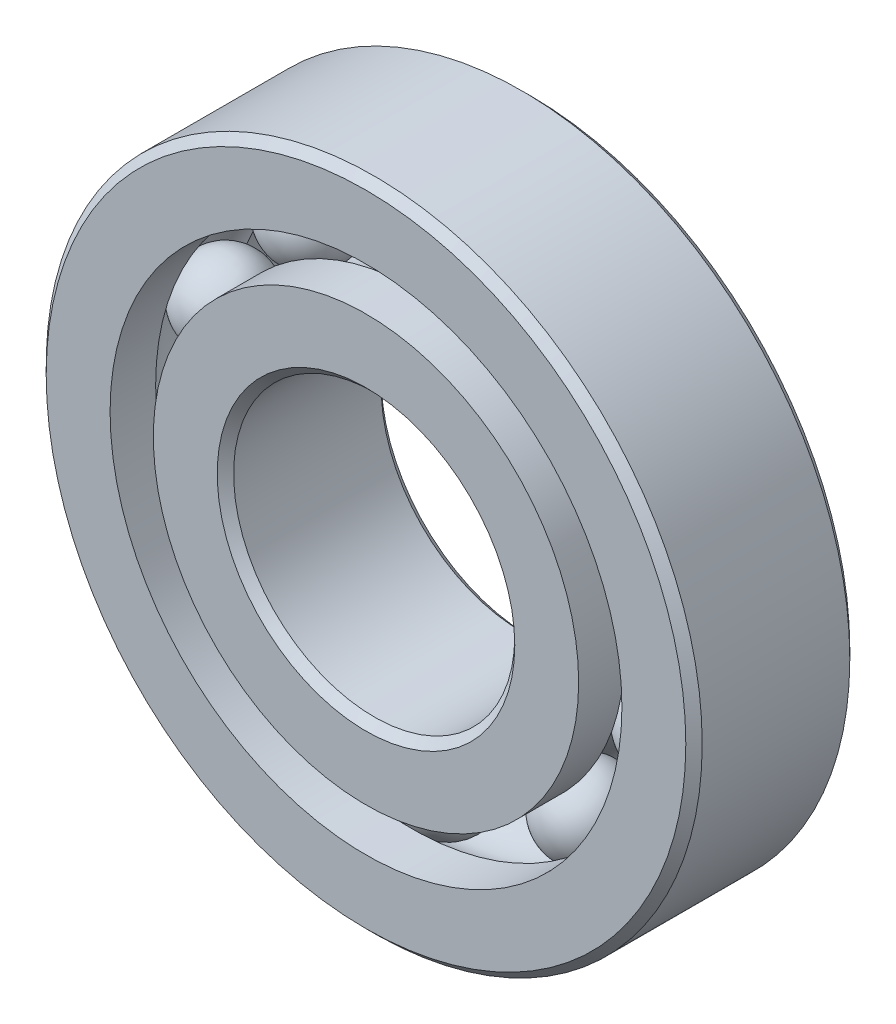
ISO-10303-21;
HEADER;
FILE_DESCRIPTION(('STEP AP214'),'2;1');
FILE_NAME('part.step','',(''),(''),'','','');
FILE_SCHEMA(('AUTOMOTIVE_DESIGN { 1 0 10303 214 1 1 1 1 }'));
ENDSEC;
DATA;
#1=APPLICATION_CONTEXT('core data for automotive mechanical design processes');
#2=APPLICATION_PROTOCOL_DEFINITION('international standard','automotive_design',2000,#1);
#3=PRODUCT_CONTEXT('',#1,'mechanical');
#4=PRODUCT('Part','Part','',(#3));
#5=PRODUCT_RELATED_PRODUCT_CATEGORY('part','',(#4));
#6=PRODUCT_DEFINITION_FORMATION('','',#4);
#7=PRODUCT_DEFINITION_CONTEXT('part definition',#1,'design');
#8=PRODUCT_DEFINITION('design','',#6,#7);
#9=PRODUCT_DEFINITION_SHAPE('','',#8);
#10=(LENGTH_UNIT() NAMED_UNIT(*) SI_UNIT(.MILLI.,.METRE.));
#11=(NAMED_UNIT(*) PLANE_ANGLE_UNIT() SI_UNIT($,.RADIAN.));
#12=(NAMED_UNIT(*) SI_UNIT($,.STERADIAN.) SOLID_ANGLE_UNIT());
#13=UNCERTAINTY_MEASURE_WITH_UNIT(LENGTH_MEASURE(1.E-05),#10,'distance_accuracy_value','');
#14=(GEOMETRIC_REPRESENTATION_CONTEXT(3) GLOBAL_UNCERTAINTY_ASSIGNED_CONTEXT((#13)) GLOBAL_UNIT_ASSIGNED_CONTEXT((#10,
#11,#12)) REPRESENTATION_CONTEXT('',''));
#15=CARTESIAN_POINT('',(0.,0.,0.));
#16=DIRECTION('',(0.,0.,1.));
#17=DIRECTION('',(1.,0.,0.));
#18=AXIS2_PLACEMENT_3D('',#15,#16,#17);
#19=CARTESIAN_POINT('',(-4.66554544007142,6.42157239285121,0.));
#20=DIRECTION('',(0.,0.,1.));
#21=DIRECTION('',(-0.587785252292462,0.809016994374955,0.));
#22=AXIS2_PLACEMENT_3D('',#19,#20,#21);
#23=SPHERICAL_SURFACE('',#22,1.43574962434293);
#24=CARTESIAN_POINT('',(-4.66554544007142,6.42157239285121,1.43574962434293));
#25=VERTEX_POINT('',#24);
#26=VERTEX_LOOP('',#25);
#27=FACE_BOUND('',#26,.T.);
#28=ADVANCED_FACE('F40',(#27),#23,.T.);
#29=CLOSED_SHELL('',(#28));
#30=MANIFOLD_SOLID_BREP('B2',#29);
#31=CARTESIAN_POINT('',(-7.54901109809275,2.45282239285123,0.));
#32=DIRECTION('',(0.,0.,1.));
#33=DIRECTION('',(-0.95105651629515,0.309016994374958,0.));
#34=AXIS2_PLACEMENT_3D('',#31,#32,#33);
#35=SPHERICAL_SURFACE('',#34,1.43574962434293);
#36=CARTESIAN_POINT('',(-7.54901109809275,2.45282239285123,1.43574962434293));
#37=VERTEX_POINT('',#36);
#38=VERTEX_LOOP('',#37);
#39=FACE_BOUND('',#38,.T.);
#40=ADVANCED_FACE('F61',(#39),#35,.T.);
#41=CLOSED_SHELL('',(#40));
#42=MANIFOLD_SOLID_BREP('B6',#41);
#43=CARTESIAN_POINT('',(-7.54901109809281,-2.45282239285107,0.));
#44=DIRECTION('',(0.,0.,1.));
#45=DIRECTION('',(-0.951056516295157,-0.309016994374938,0.));
#46=AXIS2_PLACEMENT_3D('',#43,#44,#45);
#47=SPHERICAL_SURFACE('',#46,1.43574962434293);
#48=CARTESIAN_POINT('',(-7.54901109809281,-2.45282239285107,1.43574962434293));
#49=VERTEX_POINT('',#48);
#50=VERTEX_LOOP('',#49);
#51=FACE_BOUND('',#50,.T.);
#52=ADVANCED_FACE('F82',(#51),#47,.T.);
#53=CLOSED_SHELL('',(#52));
#54=MANIFOLD_SOLID_BREP('B36',#53);
#55=CARTESIAN_POINT('',(-4.66554544007156,-6.4215723928511,0.));
#56=DIRECTION('',(0.,0.,1.));
#57=DIRECTION('',(-0.58778525229248,-0.809016994374942,0.));
#58=AXIS2_PLACEMENT_3D('',#55,#56,#57);
#59=SPHERICAL_SURFACE('',#58,1.43574962434293);
#60=CARTESIAN_POINT('',(-4.66554544007156,-6.4215723928511,1.43574962434293));
#61=VERTEX_POINT('',#60);
#62=VERTEX_LOOP('',#61);
#63=FACE_BOUND('',#62,.T.);
#64=ADVANCED_FACE('F103',(#63),#59,.T.);
#65=CLOSED_SHELL('',(#64));
#66=MANIFOLD_SOLID_BREP('B57',#65);
#67=CARTESIAN_POINT('',(0.,-7.9375,0.));
#68=DIRECTION('',(0.,0.,1.));
#69=DIRECTION('',(0.,-1.,0.));
#70=AXIS2_PLACEMENT_3D('',#67,#68,#69);
#71=SPHERICAL_SURFACE('',#70,1.43574962434293);
#72=CARTESIAN_POINT('',(0.,-7.9375,1.43574962434293));
#73=VERTEX_POINT('',#72);
#74=VERTEX_LOOP('',#73);
#75=FACE_BOUND('',#74,.T.);
#76=ADVANCED_FACE('F124',(#75),#71,.T.);
#77=CLOSED_SHELL('',(#76));
#78=MANIFOLD_SOLID_BREP('B78',#77);
#79=CARTESIAN_POINT('',(4.66554544007147,-6.42157239285117,0.));
#80=DIRECTION('',(0.,0.,1.));
#81=DIRECTION('',(0.587785252292469,-0.809016994374951,0.));
#82=AXIS2_PLACEMENT_3D('',#79,#80,#81);
#83=SPHERICAL_SURFACE('',#82,1.43574962434293);
#84=CARTESIAN_POINT('',(4.66554544007147,-6.42157239285117,1.43574962434293));
#85=VERTEX_POINT('',#84);
#86=VERTEX_LOOP('',#85);
#87=FACE_BOUND('',#86,.T.);
#88=ADVANCED_FACE('F145',(#87),#83,.T.);
#89=CLOSED_SHELL('',(#88));
#90=MANIFOLD_SOLID_BREP('B99',#89);
#91=CARTESIAN_POINT('',(7.54901109809277,-2.45282239285118,0.));
#92=DIRECTION('',(0.,0.,1.));
#93=DIRECTION('',(0.951056516295152,-0.309016994374952,0.));
#94=AXIS2_PLACEMENT_3D('',#91,#92,#93);
#95=SPHERICAL_SURFACE('',#94,1.43574962434293);
#96=CARTESIAN_POINT('',(7.54901109809277,-2.45282239285118,1.43574962434293));
#97=VERTEX_POINT('',#96);
#98=VERTEX_LOOP('',#97);
#99=FACE_BOUND('',#98,.T.);
#100=ADVANCED_FACE('F166',(#99),#95,.T.);
#101=CLOSED_SHELL('',(#100));
#102=MANIFOLD_SOLID_BREP('B120',#101);
#103=CARTESIAN_POINT('',(7.54901109809279,2.45282239285112,0.));
#104=DIRECTION('',(0.,0.,1.));
#105=DIRECTION('',(0.951056516295155,0.309016994374945,0.));
#106=AXIS2_PLACEMENT_3D('',#103,#104,#105);
#107=SPHERICAL_SURFACE('',#106,1.43574962434293);
#108=CARTESIAN_POINT('',(7.54901109809279,2.45282239285112,1.43574962434293));
#109=VERTEX_POINT('',#108);
#110=VERTEX_LOOP('',#109);
#111=FACE_BOUND('',#110,.T.);
#112=ADVANCED_FACE('F187',(#111),#107,.T.);
#113=CLOSED_SHELL('',(#112));
#114=MANIFOLD_SOLID_BREP('B141',#113);
#115=CARTESIAN_POINT('',(4.66554544007152,6.42157239285114,0.));
#116=DIRECTION('',(0.,0.,1.));
#117=DIRECTION('',(0.587785252292474,0.809016994374947,0.));
#118=AXIS2_PLACEMENT_3D('',#115,#116,#117);
#119=SPHERICAL_SURFACE('',#118,1.43574962434293);
#120=CARTESIAN_POINT('',(4.66554544007152,6.42157239285114,1.43574962434293));
#121=VERTEX_POINT('',#120);
#122=VERTEX_LOOP('',#121);
#123=FACE_BOUND('',#122,.T.);
#124=ADVANCED_FACE('F208',(#123),#119,.T.);
#125=CLOSED_SHELL('',(#124));
#126=MANIFOLD_SOLID_BREP('B162',#125);
#127=CARTESIAN_POINT('',(0.,7.9375,0.));
#128=DIRECTION('',(0.,0.,1.));
#129=DIRECTION('',(0.,1.,0.));
#130=AXIS2_PLACEMENT_3D('',#127,#128,#129);
#131=SPHERICAL_SURFACE('',#130,1.43574962434293);
#132=CARTESIAN_POINT('',(0.,7.9375,1.43574962434293));
#133=VERTEX_POINT('',#132);
#134=VERTEX_LOOP('',#133);
#135=FACE_BOUND('',#134,.T.);
#136=ADVANCED_FACE('F231',(#135),#131,.T.);
#137=CLOSED_SHELL('',(#136));
#138=MANIFOLD_SOLID_BREP('B183',#137);
#139=CARTESIAN_POINT('',(0.,7.20480769230769,2.778125));
#140=DIRECTION('',(0.,0.,-1.));
#141=DIRECTION('',(-1.,0.,0.));
#142=AXIS2_PLACEMENT_3D('',#139,#140,#141);
#143=PLANE('',#142);
#144=CARTESIAN_POINT('',(0.,0.,2.778125));
#145=DIRECTION('',(0.,0.,1.));
#146=DIRECTION('',(1.,0.,0.));
#147=AXIS2_PLACEMENT_3D('',#144,#145,#146);
#148=CIRCLE('',#147,5.0403125);
#149=CARTESIAN_POINT('',(5.0403125,0.,2.778125));
#150=VERTEX_POINT('',#149);
#151=EDGE_CURVE('E279',#150,#150,#148,.T.);
#152=ORIENTED_EDGE('',*,*,#151,.F.);
#153=EDGE_LOOP('',(#152));
#154=FACE_BOUND('',#153,.T.);
#155=CARTESIAN_POINT('',(0.,0.,2.778125));
#156=DIRECTION('',(0.,0.,1.));
#157=DIRECTION('',(1.,0.,0.));
#158=AXIS2_PLACEMENT_3D('',#155,#156,#157);
#159=CIRCLE('',#158,7.20480769230769);
#160=CARTESIAN_POINT('',(7.20480769230769,0.,2.778125));
#161=VERTEX_POINT('',#160);
#162=EDGE_CURVE('E230',#161,#161,#159,.T.);
#163=ORIENTED_EDGE('',*,*,#162,.T.);
#164=EDGE_LOOP('',(#163));
#165=FACE_BOUND('',#164,.T.);
#166=ADVANCED_FACE('F251',(#154,#165),#143,.F.);
#167=CARTESIAN_POINT('',(0.,0.,2.778125));
#168=DIRECTION('',(0.,0.,1.));
#169=DIRECTION('',(1.,0.,0.));
#170=AXIS2_PLACEMENT_3D('',#167,#168,#169);
#171=CYLINDRICAL_SURFACE('',#170,7.20480769230769);
#172=ORIENTED_EDGE('',*,*,#162,.F.);
#173=EDGE_LOOP('',(#172));
#174=FACE_BOUND('',#173,.T.);
#175=CARTESIAN_POINT('',(0.,0.,1.23472222222222));
#176=DIRECTION('',(0.,0.,1.));
#177=DIRECTION('',(1.,0.,0.));
#178=AXIS2_PLACEMENT_3D('',#175,#176,#177);
#179=CIRCLE('',#178,7.20480769230769);
#180=CARTESIAN_POINT('',(7.20480769230769,0.,1.23472222222222));
#181=VERTEX_POINT('',#180);
#182=EDGE_CURVE('E257',#181,#181,#179,.T.);
#183=ORIENTED_EDGE('',*,*,#182,.T.);
#184=EDGE_LOOP('',(#183));
#185=FACE_BOUND('',#184,.T.);
#186=ADVANCED_FACE('F286',(#174,#185),#171,.T.);
#187=CARTESIAN_POINT('',(0.,0.,0.));
#188=DIRECTION('',(0.,0.,1.));
#189=DIRECTION('',(1.,0.,0.));
#190=AXIS2_PLACEMENT_3D('',#187,#188,#189);
#191=TOROIDAL_SURFACE('',#190,7.9375,1.43574962434293);
#192=ORIENTED_EDGE('',*,*,#182,.F.);
#193=EDGE_LOOP('',(#192));
#194=FACE_BOUND('',#193,.T.);
#195=CARTESIAN_POINT('',(0.,0.,-1.23472222222222));
#196=DIRECTION('',(0.,0.,1.));
#197=DIRECTION('',(1.,0.,0.));
#198=AXIS2_PLACEMENT_3D('',#195,#196,#197);
#199=CIRCLE('',#198,7.20480769230769);
#200=CARTESIAN_POINT('',(7.20480769230769,0.,-1.23472222222222));
#201=VERTEX_POINT('',#200);
#202=EDGE_CURVE('E261',#201,#201,#199,.T.);
#203=ORIENTED_EDGE('',*,*,#202,.T.);
#204=EDGE_LOOP('',(#203));
#205=FACE_BOUND('',#204,.T.);
#206=ADVANCED_FACE('F290',(#194,#205),#191,.F.);
#207=CARTESIAN_POINT('',(0.,0.,2.778125));
#208=DIRECTION('',(0.,0.,1.));
#209=DIRECTION('',(1.,0.,0.));
#210=AXIS2_PLACEMENT_3D('',#207,#208,#209);
#211=CYLINDRICAL_SURFACE('',#210,7.20480769230769);
#212=ORIENTED_EDGE('',*,*,#202,.F.);
#213=EDGE_LOOP('',(#212));
#214=FACE_BOUND('',#213,.T.);
#215=CARTESIAN_POINT('',(0.,0.,-2.778125));
#216=DIRECTION('',(0.,0.,1.));
#217=DIRECTION('',(1.,0.,0.));
#218=AXIS2_PLACEMENT_3D('',#215,#216,#217);
#219=CIRCLE('',#218,7.20480769230769);
#220=CARTESIAN_POINT('',(7.20480769230769,0.,-2.778125));
#221=VERTEX_POINT('',#220);
#222=EDGE_CURVE('E265',#221,#221,#219,.T.);
#223=ORIENTED_EDGE('',*,*,#222,.T.);
#224=EDGE_LOOP('',(#223));
#225=FACE_BOUND('',#224,.T.);
#226=ADVANCED_FACE('F295',(#214,#225),#211,.T.);
#227=CARTESIAN_POINT('',(0.,5.0403125,-2.778125));
#228=DIRECTION('',(0.,0.,1.));
#229=DIRECTION('',(1.,0.,0.));
#230=AXIS2_PLACEMENT_3D('',#227,#228,#229);
#231=PLANE('',#230);
#232=ORIENTED_EDGE('',*,*,#222,.F.);
#233=EDGE_LOOP('',(#232));
#234=FACE_BOUND('',#233,.T.);
#235=CARTESIAN_POINT('',(0.,0.,-2.778125));
#236=DIRECTION('',(0.,0.,1.));
#237=DIRECTION('',(1.,0.,0.));
#238=AXIS2_PLACEMENT_3D('',#235,#236,#237);
#239=CIRCLE('',#238,5.0403125);
#240=CARTESIAN_POINT('',(5.0403125,0.,-2.778125));
#241=VERTEX_POINT('',#240);
#242=EDGE_CURVE('E270',#241,#241,#239,.T.);
#243=ORIENTED_EDGE('',*,*,#242,.T.);
#244=EDGE_LOOP('',(#243));
#245=FACE_BOUND('',#244,.T.);
#246=ADVANCED_FACE('F301',(#234,#245),#231,.F.);
#247=CARTESIAN_POINT('',(0.,0.,-2.5003125));
#248=DIRECTION('',(0.,0.,-1.));
#249=DIRECTION('',(-1.,0.,0.));
#250=AXIS2_PLACEMENT_3D('',#247,#248,#249);
#251=CONICAL_SURFACE('',#250,4.7625,0.785398163397444);
#252=ORIENTED_EDGE('',*,*,#242,.F.);
#253=EDGE_LOOP('',(#252));
#254=FACE_BOUND('',#253,.T.);
#255=CARTESIAN_POINT('',(0.,0.,-2.5003125));
#256=DIRECTION('',(0.,0.,1.));
#257=DIRECTION('',(1.,0.,0.));
#258=AXIS2_PLACEMENT_3D('',#255,#256,#257);
#259=CIRCLE('',#258,4.7625);
#260=CARTESIAN_POINT('',(4.7625,0.,-2.5003125));
#261=VERTEX_POINT('',#260);
#262=EDGE_CURVE('E273',#261,#261,#259,.T.);
#263=ORIENTED_EDGE('',*,*,#262,.T.);
#264=EDGE_LOOP('',(#263));
#265=FACE_BOUND('',#264,.T.);
#266=ADVANCED_FACE('F305',(#254,#265),#251,.F.);
#267=CARTESIAN_POINT('',(0.,0.,2.778125));
#268=DIRECTION('',(0.,0.,1.));
#269=DIRECTION('',(1.,0.,0.));
#270=AXIS2_PLACEMENT_3D('',#267,#268,#269);
#271=CYLINDRICAL_SURFACE('',#270,4.7625);
#272=ORIENTED_EDGE('',*,*,#262,.F.);
#273=EDGE_LOOP('',(#272));
#274=FACE_BOUND('',#273,.T.);
#275=CARTESIAN_POINT('',(0.,0.,2.5003125));
#276=DIRECTION('',(0.,0.,1.));
#277=DIRECTION('',(1.,0.,0.));
#278=AXIS2_PLACEMENT_3D('',#275,#276,#277);
#279=CIRCLE('',#278,4.7625);
#280=CARTESIAN_POINT('',(4.7625,0.,2.5003125));
#281=VERTEX_POINT('',#280);
#282=EDGE_CURVE('E276',#281,#281,#279,.T.);
#283=ORIENTED_EDGE('',*,*,#282,.T.);
#284=EDGE_LOOP('',(#283));
#285=FACE_BOUND('',#284,.T.);
#286=ADVANCED_FACE('F309',(#274,#285),#271,.F.);
#287=CARTESIAN_POINT('',(0.,0.,2.778125));
#288=DIRECTION('',(0.,0.,1.));
#289=DIRECTION('',(1.,0.,0.));
#290=AXIS2_PLACEMENT_3D('',#287,#288,#289);
#291=CONICAL_SURFACE('',#290,5.0403125,0.785398163397455);
#292=ORIENTED_EDGE('',*,*,#282,.F.);
#293=EDGE_LOOP('',(#292));
#294=FACE_BOUND('',#293,.T.);
#295=ORIENTED_EDGE('',*,*,#151,.T.);
#296=EDGE_LOOP('',(#295));
#297=FACE_BOUND('',#296,.T.);
#298=ADVANCED_FACE('F283',(#294,#297),#291,.F.);
#299=CLOSED_SHELL('',(#166,#186,#206,#226,#246,#266,#286,#298));
#300=MANIFOLD_SOLID_BREP('B204',#299);
#301=CARTESIAN_POINT('',(0.,0.,2.5003125));
#302=DIRECTION('',(0.,0.,-1.));
#303=DIRECTION('',(-1.,0.,0.));
#304=AXIS2_PLACEMENT_3D('',#301,#302,#303);
#305=CONICAL_SURFACE('',#304,11.1125,0.785398163397446);
#306=CARTESIAN_POINT('',(0.,0.,2.778125));
#307=DIRECTION('',(0.,0.,1.));
#308=DIRECTION('',(1.,0.,0.));
#309=AXIS2_PLACEMENT_3D('',#306,#307,#308);
#310=CIRCLE('',#309,10.8346875);
#311=CARTESIAN_POINT('',(10.8346875,0.,2.778125));
#312=VERTEX_POINT('',#311);
#313=EDGE_CURVE('E401',#312,#312,#310,.T.);
#314=ORIENTED_EDGE('',*,*,#313,.F.);
#315=EDGE_LOOP('',(#314));
#316=FACE_BOUND('',#315,.T.);
#317=CARTESIAN_POINT('',(0.,0.,2.5003125));
#318=DIRECTION('',(0.,0.,1.));
#319=DIRECTION('',(1.,0.,0.));
#320=AXIS2_PLACEMENT_3D('',#317,#318,#319);
#321=CIRCLE('',#320,11.1125);
#322=CARTESIAN_POINT('',(11.1125,0.,2.5003125));
#323=VERTEX_POINT('',#322);
#324=EDGE_CURVE('E250',#323,#323,#321,.T.);
#325=ORIENTED_EDGE('',*,*,#324,.T.);
#326=EDGE_LOOP('',(#325));
#327=FACE_BOUND('',#326,.T.);
#328=ADVANCED_FACE('F373',(#316,#327),#305,.T.);
#329=CARTESIAN_POINT('',(0.,0.,2.778125));
#330=DIRECTION('',(0.,0.,1.));
#331=DIRECTION('',(1.,0.,0.));
#332=AXIS2_PLACEMENT_3D('',#329,#330,#331);
#333=CYLINDRICAL_SURFACE('',#332,11.1125);
#334=ORIENTED_EDGE('',*,*,#324,.F.);
#335=EDGE_LOOP('',(#334));
#336=FACE_BOUND('',#335,.T.);
#337=CARTESIAN_POINT('',(0.,0.,-2.5003125));
#338=DIRECTION('',(0.,0.,1.));
#339=DIRECTION('',(1.,0.,0.));
#340=AXIS2_PLACEMENT_3D('',#337,#338,#339);
#341=CIRCLE('',#340,11.1125);
#342=CARTESIAN_POINT('',(11.1125,0.,-2.5003125));
#343=VERTEX_POINT('',#342);
#344=EDGE_CURVE('E379',#343,#343,#341,.T.);
#345=ORIENTED_EDGE('',*,*,#344,.T.);
#346=EDGE_LOOP('',(#345));
#347=FACE_BOUND('',#346,.T.);
#348=ADVANCED_FACE('F408',(#336,#347),#333,.T.);
#349=CARTESIAN_POINT('',(0.,0.,-2.778125));
#350=DIRECTION('',(0.,0.,1.));
#351=DIRECTION('',(1.,0.,0.));
#352=AXIS2_PLACEMENT_3D('',#349,#350,#351);
#353=CONICAL_SURFACE('',#352,10.8346875,0.785398163397445);
#354=ORIENTED_EDGE('',*,*,#344,.F.);
#355=EDGE_LOOP('',(#354));
#356=FACE_BOUND('',#355,.T.);
#357=CARTESIAN_POINT('',(0.,0.,-2.778125));
#358=DIRECTION('',(0.,0.,1.));
#359=DIRECTION('',(1.,0.,0.));
#360=AXIS2_PLACEMENT_3D('',#357,#358,#359);
#361=CIRCLE('',#360,10.8346875);
#362=CARTESIAN_POINT('',(10.8346875,0.,-2.778125));
#363=VERTEX_POINT('',#362);
#364=EDGE_CURVE('E383',#363,#363,#361,.T.);
#365=ORIENTED_EDGE('',*,*,#364,.T.);
#366=EDGE_LOOP('',(#365));
#367=FACE_BOUND('',#366,.T.);
#368=ADVANCED_FACE('F412',(#356,#367),#353,.T.);
#369=CARTESIAN_POINT('',(0.,10.8346875,-2.778125));
#370=DIRECTION('',(0.,0.,1.));
#371=DIRECTION('',(1.,0.,0.));
#372=AXIS2_PLACEMENT_3D('',#369,#370,#371);
#373=PLANE('',#372);
#374=ORIENTED_EDGE('',*,*,#364,.F.);
#375=EDGE_LOOP('',(#374));
#376=FACE_BOUND('',#375,.T.);
#377=CARTESIAN_POINT('',(0.,0.,-2.778125));
#378=DIRECTION('',(0.,0.,1.));
#379=DIRECTION('',(1.,0.,0.));
#380=AXIS2_PLACEMENT_3D('',#377,#378,#379);
#381=CIRCLE('',#380,8.67019230769231);
#382=CARTESIAN_POINT('',(8.67019230769231,0.,-2.778125));
#383=VERTEX_POINT('',#382);
#384=EDGE_CURVE('E387',#383,#383,#381,.T.);
#385=ORIENTED_EDGE('',*,*,#384,.T.);
#386=EDGE_LOOP('',(#385));
#387=FACE_BOUND('',#386,.T.);
#388=ADVANCED_FACE('F417',(#376,#387),#373,.F.);
#389=CARTESIAN_POINT('',(0.,0.,2.778125));
#390=DIRECTION('',(0.,0.,1.));
#391=DIRECTION('',(1.,0.,0.));
#392=AXIS2_PLACEMENT_3D('',#389,#390,#391);
#393=CYLINDRICAL_SURFACE('',#392,8.67019230769231);
#394=ORIENTED_EDGE('',*,*,#384,.F.);
#395=EDGE_LOOP('',(#394));
#396=FACE_BOUND('',#395,.T.);
#397=CARTESIAN_POINT('',(0.,0.,-1.23472222222222));
#398=DIRECTION('',(0.,0.,1.));
#399=DIRECTION('',(1.,0.,0.));
#400=AXIS2_PLACEMENT_3D('',#397,#398,#399);
#401=CIRCLE('',#400,8.67019230769231);
#402=CARTESIAN_POINT('',(8.67019230769231,0.,-1.23472222222222));
#403=VERTEX_POINT('',#402);
#404=EDGE_CURVE('E392',#403,#403,#401,.T.);
#405=ORIENTED_EDGE('',*,*,#404,.T.);
#406=EDGE_LOOP('',(#405));
#407=FACE_BOUND('',#406,.T.);
#408=ADVANCED_FACE('F423',(#396,#407),#393,.F.);
#409=CARTESIAN_POINT('',(0.,0.,0.));
#410=DIRECTION('',(0.,0.,1.));
#411=DIRECTION('',(1.,0.,0.));
#412=AXIS2_PLACEMENT_3D('',#409,#410,#411);
#413=TOROIDAL_SURFACE('',#412,7.9375,1.43574962434293);
#414=ORIENTED_EDGE('',*,*,#404,.F.);
#415=EDGE_LOOP('',(#414));
#416=FACE_BOUND('',#415,.T.);
#417=CARTESIAN_POINT('',(0.,0.,1.23472222222222));
#418=DIRECTION('',(0.,0.,1.));
#419=DIRECTION('',(1.,0.,0.));
#420=AXIS2_PLACEMENT_3D('',#417,#418,#419);
#421=CIRCLE('',#420,8.67019230769231);
#422=CARTESIAN_POINT('',(8.67019230769231,0.,1.23472222222222));
#423=VERTEX_POINT('',#422);
#424=EDGE_CURVE('E395',#423,#423,#421,.T.);
#425=ORIENTED_EDGE('',*,*,#424,.T.);
#426=EDGE_LOOP('',(#425));
#427=FACE_BOUND('',#426,.T.);
#428=ADVANCED_FACE('F427',(#416,#427),#413,.F.);
#429=CARTESIAN_POINT('',(0.,0.,2.778125));
#430=DIRECTION('',(0.,0.,1.));
#431=DIRECTION('',(1.,0.,0.));
#432=AXIS2_PLACEMENT_3D('',#429,#430,#431);
#433=CYLINDRICAL_SURFACE('',#432,8.67019230769231);
#434=ORIENTED_EDGE('',*,*,#424,.F.);
#435=EDGE_LOOP('',(#434));
#436=FACE_BOUND('',#435,.T.);
#437=CARTESIAN_POINT('',(0.,0.,2.778125));
#438=DIRECTION('',(0.,0.,1.));
#439=DIRECTION('',(1.,0.,0.));
#440=AXIS2_PLACEMENT_3D('',#437,#438,#439);
#441=CIRCLE('',#440,8.67019230769231);
#442=CARTESIAN_POINT('',(8.67019230769231,0.,2.778125));
#443=VERTEX_POINT('',#442);
#444=EDGE_CURVE('E398',#443,#443,#441,.T.);
#445=ORIENTED_EDGE('',*,*,#444,.T.);
#446=EDGE_LOOP('',(#445));
#447=FACE_BOUND('',#446,.T.);
#448=ADVANCED_FACE('F431',(#436,#447),#433,.F.);
#449=CARTESIAN_POINT('',(0.,10.8346875,2.778125));
#450=DIRECTION('',(0.,0.,-1.));
#451=DIRECTION('',(-1.,0.,0.));
#452=AXIS2_PLACEMENT_3D('',#449,#450,#451);
#453=PLANE('',#452);
#454=ORIENTED_EDGE('',*,*,#444,.F.);
#455=EDGE_LOOP('',(#454));
#456=FACE_BOUND('',#455,.T.);
#457=ORIENTED_EDGE('',*,*,#313,.T.);
#458=EDGE_LOOP('',(#457));
#459=FACE_BOUND('',#458,.T.);
#460=ADVANCED_FACE('F405',(#456,#459),#453,.F.);
#461=CLOSED_SHELL('',(#328,#348,#368,#388,#408,#428,#448,#460));
#462=MANIFOLD_SOLID_BREP('B225',#461);
#463=ADVANCED_BREP_SHAPE_REPRESENTATION('',(#18,#30,#42,#54,#66,#78,#90,#102,#114,#126,#138,
#300,#462),#14);
#464=SHAPE_DEFINITION_REPRESENTATION(#9,#463);
ENDSEC;
END-ISO-10303-21;
